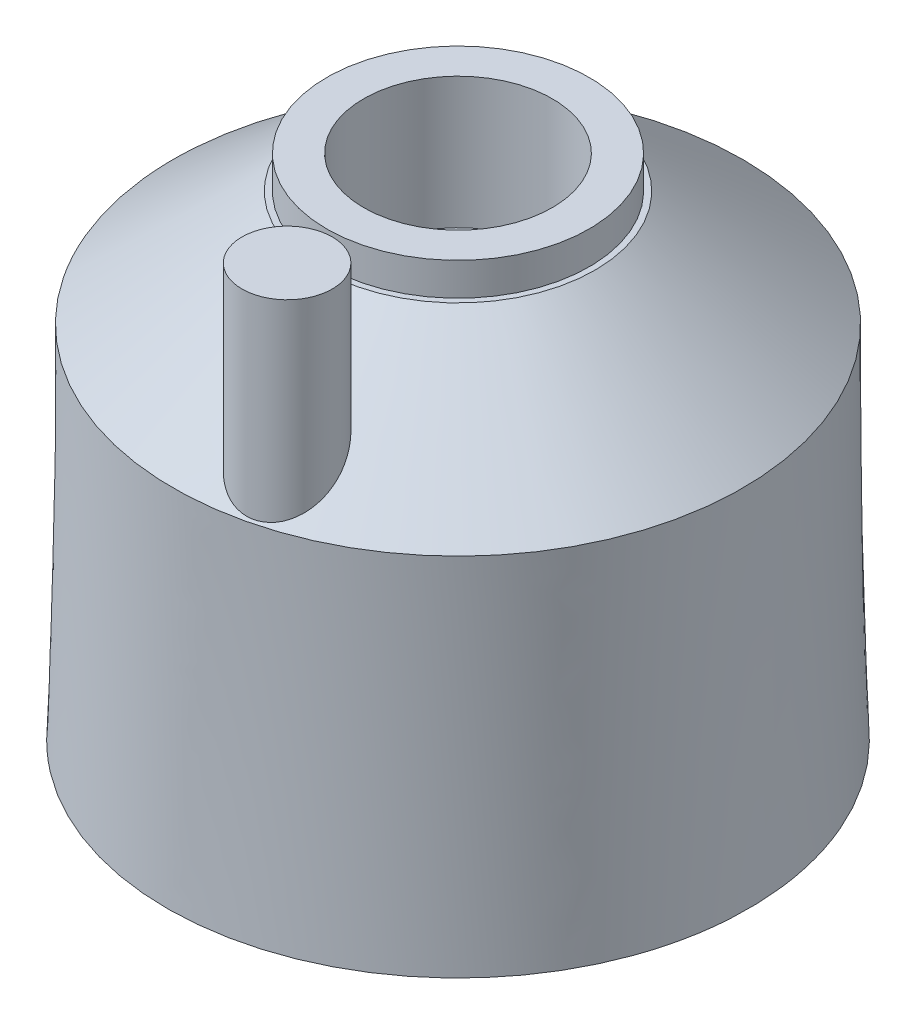
ISO-10303-21;
HEADER;
FILE_DESCRIPTION(('STEP AP214'),'2;1');
FILE_NAME('part.step','',(''),(''),'','','');
FILE_SCHEMA(('AUTOMOTIVE_DESIGN { 1 0 10303 214 1 1 1 1 }'));
ENDSEC;
DATA;
#1=APPLICATION_CONTEXT('core data for automotive mechanical design processes');
#2=APPLICATION_PROTOCOL_DEFINITION('international standard','automotive_design',2000,#1);
#3=PRODUCT_CONTEXT('',#1,'mechanical');
#4=PRODUCT('Part','Part','',(#3));
#5=PRODUCT_RELATED_PRODUCT_CATEGORY('part','',(#4));
#6=PRODUCT_DEFINITION_FORMATION('','',#4);
#7=PRODUCT_DEFINITION_CONTEXT('part definition',#1,'design');
#8=PRODUCT_DEFINITION('design','',#6,#7);
#9=PRODUCT_DEFINITION_SHAPE('','',#8);
#10=(LENGTH_UNIT() NAMED_UNIT(*) SI_UNIT(.MILLI.,.METRE.));
#11=(NAMED_UNIT(*) PLANE_ANGLE_UNIT() SI_UNIT($,.RADIAN.));
#12=(NAMED_UNIT(*) SI_UNIT($,.STERADIAN.) SOLID_ANGLE_UNIT());
#13=UNCERTAINTY_MEASURE_WITH_UNIT(LENGTH_MEASURE(1.E-05),#10,'distance_accuracy_value','');
#14=(GEOMETRIC_REPRESENTATION_CONTEXT(3) GLOBAL_UNCERTAINTY_ASSIGNED_CONTEXT((#13)) GLOBAL_UNIT_ASSIGNED_CONTEXT((#10,
#11,#12)) REPRESENTATION_CONTEXT('',''));
#15=CARTESIAN_POINT('',(0.,0.,0.));
#16=DIRECTION('',(0.,0.,1.));
#17=DIRECTION('',(1.,0.,0.));
#18=AXIS2_PLACEMENT_3D('',#15,#16,#17);
#19=CARTESIAN_POINT('',(0.,29.,0.));
#20=DIRECTION('',(0.,-1.,0.));
#21=DIRECTION('',(0.,0.,-1.));
#22=AXIS2_PLACEMENT_3D('',#19,#20,#21);
#23=CONICAL_SURFACE('',#22,8.35,0.90975315794421);
#24=CARTESIAN_POINT('',(0.,29.,0.));
#25=DIRECTION('',(0.,1.,0.));
#26=DIRECTION('',(0.,0.,1.));
#27=AXIS2_PLACEMENT_3D('',#24,#25,#26);
#28=CIRCLE('',#27,8.35);
#29=CARTESIAN_POINT('',(0.,29.,8.35));
#30=VERTEX_POINT('',#29);
#31=EDGE_CURVE('E77',#30,#30,#28,.T.);
#32=ORIENTED_EDGE('',*,*,#31,.F.);
#33=EDGE_LOOP('',(#32));
#34=FACE_BOUND('',#33,.T.);
#35=CARTESIAN_POINT('',(0.,22.,0.));
#36=DIRECTION('',(0.,1.,0.));
#37=DIRECTION('',(0.,0.,1.));
#38=AXIS2_PLACEMENT_3D('',#35,#36,#37);
#39=CIRCLE('',#38,17.35);
#40=CARTESIAN_POINT('',(16.7912796907058,22.,-4.36754236939843));
#41=VERTEX_POINT('',#40);
#42=EDGE_CURVE('E57',#41,#41,#39,.T.);
#43=ORIENTED_EDGE('',*,*,#42,.T.);
#44=EDGE_LOOP('',(#43));
#45=FACE_BOUND('',#44,.T.);
#46=CARTESIAN_POINT('',(1.31806275329674,25.7602770118223,12.4457582991912));
#47=CARTESIAN_POINT('',(1.39086732562029,25.8365053502637,12.3394836547553));
#48=CARTESIAN_POINT('',(1.47237304462429,25.9088550600034,12.2364898900073));
#49=CARTESIAN_POINT('',(1.65346726913648,26.0426812574794,12.0396894229953));
#50=CARTESIAN_POINT('',(1.75302766396208,26.1041743589928,11.9458687831035));
#51=CARTESIAN_POINT('',(1.95219810960781,26.2034350757664,11.7854160677348));
#52=CARTESIAN_POINT('',(2.04912059425793,26.243439931107,11.7168486482631));
#53=CARTESIAN_POINT('',(2.25437170456564,26.3104662643113,11.591314627974));
#54=CARTESIAN_POINT('',(2.36269286454597,26.3374961765068,11.5343405048775));
#55=CARTESIAN_POINT('',(2.58907739031103,26.376419822154,11.4343444601625));
#56=CARTESIAN_POINT('',(2.70719805499778,26.3882167140653,11.3914130881239));
#57=CARTESIAN_POINT('',(2.94865797021812,26.3951461224992,11.3221038914981));
#58=CARTESIAN_POINT('',(3.07199540503418,26.3902843907431,11.2957203571621));
#59=CARTESIAN_POINT('',(3.30647806824605,26.3657862489456,11.2620217581675));
#60=CARTESIAN_POINT('',(3.41755741565947,26.347738817256,11.2530090855312));
#61=CARTESIAN_POINT('',(3.63746112413393,26.300090045234,11.2482661943418));
#62=CARTESIAN_POINT('',(3.74628459018473,26.2704842081748,11.2525411497705));
#63=CARTESIAN_POINT('',(3.99281303644588,26.1907754115301,11.2765215456305));
#64=CARTESIAN_POINT('',(4.12895265167577,26.1371601838081,11.3006196168614));
#65=CARTESIAN_POINT('',(4.39095769935771,26.0173282533225,11.36674032747));
#66=CARTESIAN_POINT('',(4.51680286032166,25.9510875037901,11.4087973645146));
#67=CARTESIAN_POINT('',(4.79572665627096,25.7866243299564,11.5240426348107));
#68=CARTESIAN_POINT('',(4.94443882650253,25.6849893854292,11.6029009170263));
#69=CARTESIAN_POINT('',(5.22038387559965,25.471874199784,11.7817225099712));
#70=CARTESIAN_POINT('',(5.34759661558852,25.3603848751255,11.8817054134212));
#71=CARTESIAN_POINT('',(5.58264615640245,25.1291818928382,12.1012641843579));
#72=CARTESIAN_POINT('',(5.69000457776065,25.0093425366856,12.2212169230014));
#73=CARTESIAN_POINT('',(5.88127344399911,24.7668584624981,12.4758865391442));
#74=CARTESIAN_POINT('',(5.96518556490588,24.6442139456645,12.6106023603659));
#75=CARTESIAN_POINT('',(6.12296226420338,24.374040676209,12.9202389334482));
#76=CARTESIAN_POINT('',(6.19150366752795,24.2264171973616,13.0978253659899));
#77=CARTESIAN_POINT('',(6.29112256708793,23.9343100634259,13.4659754192946));
#78=CARTESIAN_POINT('',(6.32215624291774,23.7898302741774,13.6565539448138));
#79=CARTESIAN_POINT('',(6.34337775131063,23.5057800738514,14.0484207677255));
#80=CARTESIAN_POINT('',(6.33295081634957,23.3663147284963,14.2498262429692));
#81=CARTESIAN_POINT('',(6.28271015537265,23.1665498552063,14.5519012005513));
#82=CARTESIAN_POINT('',(6.26021283207543,23.1015584223692,14.6525461336786));
#83=CARTESIAN_POINT('',(6.20323123749532,22.9753469098673,14.8527721128377));
#84=CARTESIAN_POINT('',(6.16875343723414,22.9141248152395,14.9523537033452));
#85=CARTESIAN_POINT('',(6.07272841150266,22.774994601413,15.184592531252));
#86=CARTESIAN_POINT('',(6.00590553685701,22.6990015391064,15.3162686480642));
#87=CARTESIAN_POINT('',(5.84864505846642,22.5577307571285,15.5711722970948));
#88=CARTESIAN_POINT('',(5.7582190484286,22.4924478022888,15.6944039397686));
#89=CARTESIAN_POINT('',(5.6049593500457,22.4043115340826,15.8695855386581));
#90=CARTESIAN_POINT('',(5.55064504913433,22.3764590193958,15.9266079306998));
#91=CARTESIAN_POINT('',(5.43639091990016,22.3244836669009,16.0365444355164));
#92=CARTESIAN_POINT('',(5.37645413932863,22.3003588270106,16.089460745954));
#93=CARTESIAN_POINT('',(5.25128847861657,22.2561741418305,16.1904780102083));
#94=CARTESIAN_POINT('',(5.18606176006767,22.2361126477667,16.2385809131247));
#95=CARTESIAN_POINT('',(5.05080902554611,22.2003509809141,16.3292922049346));
#96=CARTESIAN_POINT('',(4.98078388780948,22.1846500126793,16.3719015951926));
#97=CARTESIAN_POINT('',(4.78405855860511,22.1481516988434,16.4797170034233));
#98=CARTESIAN_POINT('',(4.65308503971558,22.1319158941616,16.5389010470019));
#99=CARTESIAN_POINT('',(4.38271193729935,22.1141615981767,16.6362000014479));
#100=CARTESIAN_POINT('',(4.24331775582506,22.1126337701678,16.6743282641485));
#101=CARTESIAN_POINT('',(3.97384659177816,22.1237884385373,16.725748969835));
#102=CARTESIAN_POINT('',(3.84408310989243,22.1351843583824,16.7409935468429));
#103=CARTESIAN_POINT('',(3.58528409357695,22.1696190324754,16.7530493511969));
#104=CARTESIAN_POINT('',(3.45624852942515,22.1926573078166,16.749861336709));
#105=CARTESIAN_POINT('',(3.20044557724162,22.2498194922633,16.7258089353665));
#106=CARTESIAN_POINT('',(3.07373707548886,22.2840973283329,16.7046922368798));
#107=CARTESIAN_POINT('',(2.82733063567493,22.3623604553837,16.6461056893426));
#108=CARTESIAN_POINT('',(2.70763489588877,22.4063487699026,16.6086307432882));
#109=CARTESIAN_POINT('',(2.46573951876887,22.5075206937206,16.5148294390968));
#110=CARTESIAN_POINT('',(2.34450143082007,22.5655869897642,16.4569848007703));
#111=CARTESIAN_POINT('',(2.1148691812472,22.6900587825763,16.3267127965557));
#112=CARTESIAN_POINT('',(2.00648133605742,22.7564683476508,16.254278305966));
#113=CARTESIAN_POINT('',(1.78770814288779,22.9069813770779,16.0851901807643));
#114=CARTESIAN_POINT('',(1.67967041391239,22.9922268762205,15.9865200664086));
#115=CARTESIAN_POINT('',(1.48296180995107,23.169621891818,15.7768993145599));
#116=CARTESIAN_POINT('',(1.39430297577055,23.2617756531457,15.6659411061675));
#117=CARTESIAN_POINT('',(1.22243814210719,23.468178901631,15.4141582170714));
#118=CARTESIAN_POINT('',(1.14305381201753,23.5834293901588,15.2715439483421));
#119=CARTESIAN_POINT('',(1.01142813804977,23.8185244250889,14.9778872043007));
#120=CARTESIAN_POINT('',(0.959198890688865,23.9383709933824,14.8268410060166));
#121=CARTESIAN_POINT('',(0.875588643868319,24.1994455113879,14.4957623042656));
#122=CARTESIAN_POINT('',(0.848757255483346,24.34108101419,14.3148966717366));
#123=CARTESIAN_POINT('',(0.831123637509157,24.6244643998952,13.9509557733317));
#124=CARTESIAN_POINT('',(0.840378551914667,24.7662121053766,13.7678774609046));
#125=CARTESIAN_POINT('',(0.883076817667761,24.9817872637819,13.4874095144047));
#126=CARTESIAN_POINT('',(0.90354993292007,25.0570820135917,13.3890540074239));
#127=CARTESIAN_POINT('',(0.955601995548623,25.2057261658036,13.1938307342643));
#128=CARTESIAN_POINT('',(0.987183958346234,25.2790750341898,13.0969633794929));
#129=CARTESIAN_POINT('',(1.09898535325141,25.4946063525936,12.8102046758123));
#130=CARTESIAN_POINT('',(1.19636868909482,25.6328600651081,12.6233981505119));
#131=CARTESIAN_POINT('',(1.31806275329674,25.7602770118223,12.4457582991912));
#132=B_SPLINE_CURVE_WITH_KNOTS('',3,(#46,#47,#48,#49,#50,#51,#52,#53,#54,#55,#56,#57,#58,#59,
#60,#61,#62,#63,#64,#65,#66,#67,#68,#69,#70,#71,#72,#73,#74,#75,#76,#77,#78,#79,#80,#81,#82,#83,
#84,#85,#86,#87,#88,#89,#90,#91,#92,#93,#94,#95,#96,#97,#98,#99,#100,#101,#102,#103,#104,#105,
#106,#107,#108,#109,#110,#111,#112,#113,#114,#115,#116,#117,#118,#119,#120,#121,#122,#123,#124,
#125,#126,#127,#128,#129,#130,#131),.UNSPECIFIED.,.T.,.F.,(4,2,2,2,2,2,2,2,2,2,2,2,2,2,2,2,2,2,
2,2,2,2,2,2,2,2,2,2,2,2,2,2,2,2,2,2,2,2,2,2,2,2,4),(0.,0.448502950085429,0.896313495868304,
1.27066057535182,1.64476398073776,2.02123416688407,2.39757438230438,2.73477933207967,
3.0721156003106,3.51455439744697,3.95784444691415,4.54459210345606,5.13188636615154,
5.73187815091715,6.33182703511691,7.05117555456363,7.77136368145535,8.50227010556106,
8.86742459910478,9.23238216734019,9.72855965686236,10.2244938843566,10.4747729547929,
10.7249171330638,10.9749596066931,11.2249564376279,11.6562517969862,12.0872733495686,
12.4788835580852,12.8704776590804,13.2676758184429,13.6649978277065,14.1023286627608,
14.5398735807885,15.0459705106073,15.5523810083913,16.1495056041606,16.7468959679511,
17.4379007276884,18.1300001630627,18.5061654899787,18.8824330033199,19.6321132096657),.UNSPECIFIED.);
#133=CARTESIAN_POINT('',(1.31806275329674,25.7602770118223,12.4457582991912));
#134=VERTEX_POINT('',#133);
#135=EDGE_CURVE('E48',#134,#134,#132,.T.);
#136=ORIENTED_EDGE('',*,*,#135,.T.);
#137=EDGE_LOOP('',(#136));
#138=FACE_BOUND('',#137,.T.);
#139=ADVANCED_FACE('F41',(#34,#45,#138),#23,.T.);
#140=CARTESIAN_POINT('',(0.,0.,0.));
#141=DIRECTION('',(0.,1.,0.));
#142=DIRECTION('',(0.,0.,1.));
#143=AXIS2_PLACEMENT_3D('',#140,#141,#142);
#144=PLANE('',#143);
#145=CARTESIAN_POINT('',(0.,0.,0.));
#146=DIRECTION('',(0.,1.,0.));
#147=DIRECTION('',(0.,0.,1.));
#148=AXIS2_PLACEMENT_3D('',#145,#146,#147);
#149=CIRCLE('',#148,17.725);
#150=CARTESIAN_POINT('',(17.7169394339596,0.,-0.534492369829689));
#151=VERTEX_POINT('',#150);
#152=EDGE_CURVE('E62',#151,#151,#149,.T.);
#153=ORIENTED_EDGE('',*,*,#152,.F.);
#154=EDGE_LOOP('',(#153));
#155=FACE_BOUND('',#154,.T.);
#156=ADVANCED_FACE('F90',(#155),#144,.F.);
#157=CARTESIAN_POINT('',(17.7169394339596,0.,-0.534492369829689));
#158=CARTESIAN_POINT('',(16.7912796907058,22.,-4.36754236939843));
#159=CARTESIAN_POINT('',(16.6479546943003,0.,-35.9683712377489));
#160=CARTESIAN_POINT('',(8.05619495190897,22.,-37.9501017508101));
#161=CARTESIAN_POINT('',(-18.785924173619,0.,-34.8993864980896));
#162=CARTESIAN_POINT('',(-25.5263644295027,22.,-29.2150170120132));
#163=CARTESIAN_POINT('',(-17.7169394339596,0.,0.53449236982969));
#164=CARTESIAN_POINT('',(-16.7912796907058,22.,4.36754236939842));
#165=CARTESIAN_POINT('',(-16.6479546943003,0.,35.968371237749));
#166=CARTESIAN_POINT('',(-8.05619495190897,22.,37.9501017508101));
#167=CARTESIAN_POINT('',(18.785924173619,0.,34.8993864980896));
#168=CARTESIAN_POINT('',(25.5263644295027,22.,29.2150170120132));
#169=CARTESIAN_POINT('',(17.7169394339596,0.,-0.534492369829689));
#170=CARTESIAN_POINT('',(16.7912796907058,22.,-4.36754236939843));
#171=(BOUNDED_SURFACE() B_SPLINE_SURFACE(3,1,((#157,#158),(#159,#160),(#161,#162),(#163,#164),
(#165,#166),(#167,#168),(#169,#170)),.UNSPECIFIED.,.T.,.F.,.F.) B_SPLINE_SURFACE_WITH_KNOTS((4,
3,4),(2,2),(0.,0.5,1.),(0.,1.),
.UNSPECIFIED.) GEOMETRIC_REPRESENTATION_ITEM() RATIONAL_B_SPLINE_SURFACE(((1.,1.),
(0.333333333333333,0.333333333333333),(0.333333333333333,0.333333333333333),(1.,1.),
(0.333333333333333,0.333333333333333),(0.333333333333333,0.333333333333333),(1.,1.))) REPRESENTATION_ITEM('') SURFACE());
#172=CARTESIAN_POINT('',(17.7169394339596,0.,-0.534492369829689));
#173=CARTESIAN_POINT('',(17.7072971449674,0.229166666666666,-0.574419973991863));
#174=CARTESIAN_POINT('',(17.6976548559752,0.458333333333333,-0.614347578154037));
#175=CARTESIAN_POINT('',(17.6783702779907,0.916666666666667,-0.694202786478386));
#176=CARTESIAN_POINT('',(17.6687279889985,1.14583333333333,-0.734130390640561));
#177=CARTESIAN_POINT('',(17.649443411014,1.60416666666667,-0.813985598964909));
#178=CARTESIAN_POINT('',(17.6398011220218,1.83333333333333,-0.853913203127084));
#179=CARTESIAN_POINT('',(17.6205165440374,2.29166666666667,-0.933768411451432));
#180=CARTESIAN_POINT('',(17.6108742550451,2.52083333333333,-0.973696015613607));
#181=CARTESIAN_POINT('',(17.5915896770607,2.97916666666667,-1.05355122393796));
#182=CARTESIAN_POINT('',(17.5819473880684,3.20833333333333,-1.09347882810013));
#183=CARTESIAN_POINT('',(17.562662810084,3.66666666666667,-1.17333403642448));
#184=CARTESIAN_POINT('',(17.5530205210918,3.89583333333333,-1.21326164058665));
#185=CARTESIAN_POINT('',(17.5337359431073,4.35416666666667,-1.293116848911));
#186=CARTESIAN_POINT('',(17.5240936541151,4.58333333333333,-1.33304445307318));
#187=CARTESIAN_POINT('',(17.5048090761306,5.04166666666667,-1.41289966139752));
#188=CARTESIAN_POINT('',(17.4951667871384,5.27083333333333,-1.4528272655597));
#189=CARTESIAN_POINT('',(17.475882209154,5.72916666666667,-1.53268247388405));
#190=CARTESIAN_POINT('',(17.4662399201617,5.95833333333333,-1.57261007804622));
#191=CARTESIAN_POINT('',(17.4469553421773,6.41666666666667,-1.65246528637057));
#192=CARTESIAN_POINT('',(17.437313053185,6.64583333333333,-1.69239289053274));
#193=CARTESIAN_POINT('',(17.4180284752006,7.10416666666667,-1.77224809885709));
#194=CARTESIAN_POINT('',(17.4083861862084,7.33333333333333,-1.81217570301927));
#195=CARTESIAN_POINT('',(17.3891016082239,7.79166666666667,-1.89203091134362));
#196=CARTESIAN_POINT('',(17.3794593192317,8.02083333333333,-1.93195851550579));
#197=CARTESIAN_POINT('',(17.3601747412472,8.47916666666667,-2.01181372383014));
#198=CARTESIAN_POINT('',(17.350532452255,8.70833333333333,-2.05174132799231));
#199=CARTESIAN_POINT('',(17.3312478742705,9.16666666666667,-2.13159653631666));
#200=CARTESIAN_POINT('',(17.3216055852783,9.39583333333333,-2.17152414047884));
#201=CARTESIAN_POINT('',(17.3023210072939,9.85416666666667,-2.25137934880319));
#202=CARTESIAN_POINT('',(17.2926787183016,10.0833333333333,-2.29130695296536));
#203=CARTESIAN_POINT('',(17.2733941403172,10.5416666666667,-2.37116216128971));
#204=CARTESIAN_POINT('',(17.263751851325,10.7708333333333,-2.41108976545188));
#205=CARTESIAN_POINT('',(17.2444672733405,11.2291666666667,-2.49094497377623));
#206=CARTESIAN_POINT('',(17.2348249843483,11.4583333333333,-2.53087257793841));
#207=CARTESIAN_POINT('',(17.2155404063638,11.9166666666667,-2.61072778626275));
#208=CARTESIAN_POINT('',(17.2058981173716,12.1458333333333,-2.65065539042493));
#209=CARTESIAN_POINT('',(17.1866135393871,12.6041666666667,-2.73051059874928));
#210=CARTESIAN_POINT('',(17.1769712503949,12.8333333333333,-2.77043820291145));
#211=CARTESIAN_POINT('',(17.1576866724105,13.2916666666667,-2.8502934112358));
#212=CARTESIAN_POINT('',(17.1480443834182,13.5208333333333,-2.89022101539798));
#213=CARTESIAN_POINT('',(17.1287598054338,13.9791666666667,-2.97007622372232));
#214=CARTESIAN_POINT('',(17.1191175164415,14.2083333333333,-3.0100038278845));
#215=CARTESIAN_POINT('',(17.0998329384571,14.6666666666667,-3.08985903620885));
#216=CARTESIAN_POINT('',(17.0901906494649,14.8958333333333,-3.12978664037102));
#217=CARTESIAN_POINT('',(17.0709060714804,15.3541666666667,-3.20964184869537));
#218=CARTESIAN_POINT('',(17.0612637824882,15.5833333333333,-3.24956945285754));
#219=CARTESIAN_POINT('',(17.0419792045037,16.0416666666667,-3.32942466118189));
#220=CARTESIAN_POINT('',(17.0323369155115,16.2708333333333,-3.36935226534407));
#221=CARTESIAN_POINT('',(17.013052337527,16.7291666666667,-3.44920747366842));
#222=CARTESIAN_POINT('',(17.0034100485348,16.9583333333333,-3.48913507783059));
#223=CARTESIAN_POINT('',(16.9841254705504,17.4166666666667,-3.56899028615494));
#224=CARTESIAN_POINT('',(16.9744831815581,17.6458333333333,-3.60891789031711));
#225=CARTESIAN_POINT('',(16.9551986035737,18.1041666666667,-3.68877309864146));
#226=CARTESIAN_POINT('',(16.9455563145815,18.3333333333333,-3.72870070280364));
#227=CARTESIAN_POINT('',(16.926271736597,18.7916666666667,-3.80855591112799));
#228=CARTESIAN_POINT('',(16.9166294476048,19.0208333333333,-3.84848351529016));
#229=CARTESIAN_POINT('',(16.8973448696203,19.4791666666667,-3.92833872361451));
#230=CARTESIAN_POINT('',(16.8877025806281,19.7083333333333,-3.96826632777668));
#231=CARTESIAN_POINT('',(16.8684180026436,20.1666666666667,-4.04812153610103));
#232=CARTESIAN_POINT('',(16.8587757136514,20.3958333333333,-4.08804914026321));
#233=CARTESIAN_POINT('',(16.839491135667,20.8541666666667,-4.16790434858755));
#234=CARTESIAN_POINT('',(16.8298488466747,21.0833333333333,-4.20783195274973));
#235=CARTESIAN_POINT('',(16.8105642686903,21.5416666666667,-4.28768716107408));
#236=CARTESIAN_POINT('',(16.800921979698,21.7708333333333,-4.32761476523625));
#237=CARTESIAN_POINT('',(16.7912796907058,22.,-4.36754236939843));
#238=B_SPLINE_CURVE_WITH_KNOTS('',3,(#172,#173,#174,#175,#176,#177,#178,#179,#180,#181,#182,
#183,#184,#185,#186,#187,#188,#189,#190,#191,#192,#193,#194,#195,#196,#197,#198,#199,#200,#201,
#202,#203,#204,#205,#206,#207,#208,#209,#210,#211,#212,#213,#214,#215,#216,#217,#218,#219,#220,
#221,#222,#223,#224,#225,#226,#227,#228,#229,#230,#231,#232,#233,#234,#235,#236,#237),
.UNSPECIFIED.,.F.,.F.,(4,2,2,2,2,2,2,2,2,2,2,2,2,2,2,2,2,2,2,2,2,2,2,2,2,2,2,2,2,2,2,2,4),(0.,
0.698456108714261,1.39691221742852,2.09536832614278,2.79382443485705,3.49228054357131,
4.19073665228557,4.88919276099983,5.58764886971409,6.28610497842835,6.98456108714261,
7.68301719585688,8.38147330457114,9.0799294132854,9.77838552199966,10.4768416307139,
11.1752977394282,11.8737538481424,12.5722099568567,13.270666065571,13.9691221742852,
14.6675782829995,15.3660343917137,16.064490500428,16.7629466091423,17.4614027178565,
18.1598588265708,18.8583149352851,19.5567710439993,20.2552271527136,20.9536832614278,
21.6521393701421,22.3505954788564),.UNSPECIFIED.);
#239=EDGE_CURVE('BSEAM43',#151,#41,#238,.T.);
#240=ORIENTED_EDGE('',*,*,#152,.T.);
#241=ORIENTED_EDGE('',*,*,#42,.F.);
#242=ORIENTED_EDGE('',*,*,#239,.T.);
#243=ORIENTED_EDGE('',*,*,#239,.F.);
#244=EDGE_LOOP('',(#240,#242,#241,#243));
#245=FACE_BOUND('',#244,.T.);
#246=ADVANCED_FACE('F43',(#245),#171,.T.);
#247=CARTESIAN_POINT('',(0.,29.,0.));
#248=DIRECTION('',(0.,1.,0.));
#249=DIRECTION('',(0.,0.,1.));
#250=AXIS2_PLACEMENT_3D('',#247,#248,#249);
#251=PLANE('',#250);
#252=CARTESIAN_POINT('',(0.,29.,0.));
#253=DIRECTION('',(0.,1.,0.));
#254=DIRECTION('',(0.,0.,1.));
#255=AXIS2_PLACEMENT_3D('',#252,#253,#254);
#256=CIRCLE('',#255,8.);
#257=CARTESIAN_POINT('',(0.,29.,8.));
#258=VERTEX_POINT('',#257);
#259=EDGE_CURVE('E11',#258,#258,#256,.T.);
#260=ORIENTED_EDGE('',*,*,#259,.F.);
#261=EDGE_LOOP('',(#260));
#262=FACE_BOUND('',#261,.T.);
#263=ORIENTED_EDGE('',*,*,#31,.T.);
#264=EDGE_LOOP('',(#263));
#265=FACE_BOUND('',#264,.T.);
#266=ADVANCED_FACE('F91',(#262,#265),#251,.T.);
#267=CARTESIAN_POINT('',(3.58672595780263,34.,14.));
#268=DIRECTION('',(0.,-1.,0.));
#269=DIRECTION('',(0.,0.,-1.));
#270=AXIS2_PLACEMENT_3D('',#267,#268,#269);
#271=CYLINDRICAL_SURFACE('',#270,2.75);
#272=ORIENTED_EDGE('',*,*,#135,.F.);
#273=EDGE_LOOP('',(#272));
#274=FACE_BOUND('',#273,.T.);
#275=CARTESIAN_POINT('',(3.58672595780263,34.,14.));
#276=DIRECTION('',(0.,1.,0.));
#277=DIRECTION('',(0.,0.,1.));
#278=AXIS2_PLACEMENT_3D('',#275,#276,#277);
#279=CIRCLE('',#278,2.75);
#280=CARTESIAN_POINT('',(3.58672595780263,34.,16.75));
#281=VERTEX_POINT('',#280);
#282=EDGE_CURVE('E70',#281,#281,#279,.T.);
#283=ORIENTED_EDGE('',*,*,#282,.F.);
#284=EDGE_LOOP('',(#283));
#285=FACE_BOUND('',#284,.T.);
#286=ADVANCED_FACE('F136',(#274,#285),#271,.T.);
#287=CARTESIAN_POINT('',(3.58672595780263,34.,14.));
#288=DIRECTION('',(0.,1.,0.));
#289=DIRECTION('',(0.,0.,1.));
#290=AXIS2_PLACEMENT_3D('',#287,#288,#289);
#291=PLANE('',#290);
#292=ORIENTED_EDGE('',*,*,#282,.T.);
#293=EDGE_LOOP('',(#292));
#294=FACE_BOUND('',#293,.T.);
#295=ADVANCED_FACE('F139',(#294),#291,.T.);
#296=CARTESIAN_POINT('',(0.,31.,0.));
#297=DIRECTION('',(0.,1.,0.));
#298=DIRECTION('',(0.,0.,1.));
#299=AXIS2_PLACEMENT_3D('',#296,#297,#298);
#300=PLANE('',#299);
#301=CARTESIAN_POINT('',(0.,31.,0.));
#302=DIRECTION('',(0.,1.,0.));
#303=DIRECTION('',(0.,0.,1.));
#304=AXIS2_PLACEMENT_3D('',#301,#302,#303);
#305=CIRCLE('',#304,8.);
#306=CARTESIAN_POINT('',(0.,31.,8.));
#307=VERTEX_POINT('',#306);
#308=EDGE_CURVE('E65',#307,#307,#305,.T.);
#309=ORIENTED_EDGE('',*,*,#308,.T.);
#310=EDGE_LOOP('',(#309));
#311=FACE_BOUND('',#310,.T.);
#312=CARTESIAN_POINT('',(0.,31.,0.));
#313=DIRECTION('',(0.,1.,0.));
#314=DIRECTION('',(0.,0.,1.));
#315=AXIS2_PLACEMENT_3D('',#312,#313,#314);
#316=CIRCLE('',#315,5.75);
#317=CARTESIAN_POINT('',(0.,31.,5.75));
#318=VERTEX_POINT('',#317);
#319=EDGE_CURVE('E167',#318,#318,#316,.T.);
#320=ORIENTED_EDGE('',*,*,#319,.F.);
#321=EDGE_LOOP('',(#320));
#322=FACE_BOUND('',#321,.T.);
#323=ADVANCED_FACE('F143',(#311,#322),#300,.T.);
#324=CARTESIAN_POINT('',(0.,31.,0.));
#325=DIRECTION('',(0.,-1.,0.));
#326=DIRECTION('',(0.,0.,-1.));
#327=AXIS2_PLACEMENT_3D('',#324,#325,#326);
#328=CYLINDRICAL_SURFACE('',#327,8.);
#329=ORIENTED_EDGE('',*,*,#308,.F.);
#330=EDGE_LOOP('',(#329));
#331=FACE_BOUND('',#330,.T.);
#332=ORIENTED_EDGE('',*,*,#259,.T.);
#333=EDGE_LOOP('',(#332));
#334=FACE_BOUND('',#333,.T.);
#335=ADVANCED_FACE('F148',(#331,#334),#328,.T.);
#336=CARTESIAN_POINT('',(0.,23.,0.));
#337=DIRECTION('',(0.,1.,0.));
#338=DIRECTION('',(0.,0.,1.));
#339=AXIS2_PLACEMENT_3D('',#336,#337,#338);
#340=PLANE('',#339);
#341=CARTESIAN_POINT('',(0.,23.,0.));
#342=DIRECTION('',(0.,1.,0.));
#343=DIRECTION('',(0.,0.,1.));
#344=AXIS2_PLACEMENT_3D('',#341,#342,#343);
#345=CIRCLE('',#344,5.75);
#346=CARTESIAN_POINT('',(0.,23.,5.75));
#347=VERTEX_POINT('',#346);
#348=EDGE_CURVE('E67',#347,#347,#345,.T.);
#349=ORIENTED_EDGE('',*,*,#348,.T.);
#350=EDGE_LOOP('',(#349));
#351=FACE_BOUND('',#350,.T.);
#352=ADVANCED_FACE('F156',(#351),#340,.T.);
#353=CARTESIAN_POINT('',(0.,23.,0.));
#354=DIRECTION('',(0.,1.,0.));
#355=DIRECTION('',(0.,0.,1.));
#356=AXIS2_PLACEMENT_3D('',#353,#354,#355);
#357=CYLINDRICAL_SURFACE('',#356,5.75);
#358=ORIENTED_EDGE('',*,*,#348,.F.);
#359=EDGE_LOOP('',(#358));
#360=FACE_BOUND('',#359,.T.);
#361=ORIENTED_EDGE('',*,*,#319,.T.);
#362=EDGE_LOOP('',(#361));
#363=FACE_BOUND('',#362,.T.);
#364=ADVANCED_FACE('F152',(#360,#363),#357,.F.);
#365=CLOSED_SHELL('',(#139,#156,#246,#266,#286,#295,#323,#335,#352,#364));
#366=MANIFOLD_SOLID_BREP('B2',#365);
#367=ADVANCED_BREP_SHAPE_REPRESENTATION('',(#18,#366),#14);
#368=SHAPE_DEFINITION_REPRESENTATION(#9,#367);
ENDSEC;
END-ISO-10303-21;
